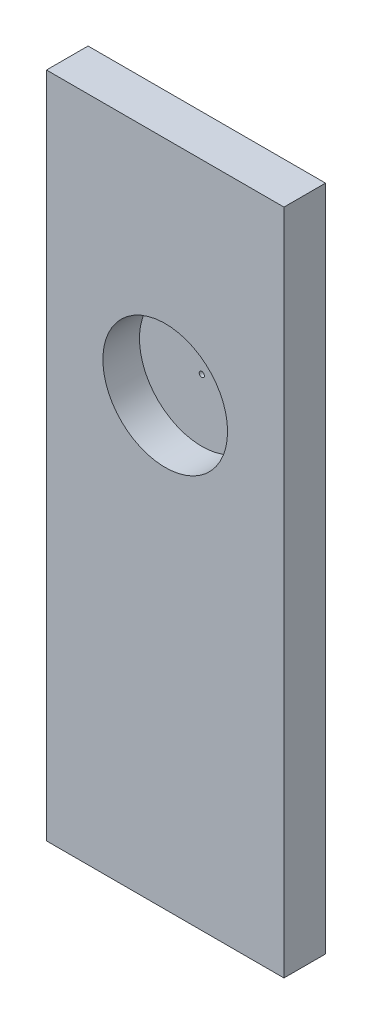
ISO-10303-21;
HEADER;
FILE_DESCRIPTION(('STEP AP214'),'2;1');
FILE_NAME('part.step','',(''),(''),'','','');
FILE_SCHEMA(('AUTOMOTIVE_DESIGN { 1 0 10303 214 1 1 1 1 }'));
ENDSEC;
DATA;
#1=APPLICATION_CONTEXT('core data for automotive mechanical design processes');
#2=APPLICATION_PROTOCOL_DEFINITION('international standard','automotive_design',2000,#1);
#3=PRODUCT_CONTEXT('',#1,'mechanical');
#4=PRODUCT('Part','Part','',(#3));
#5=PRODUCT_RELATED_PRODUCT_CATEGORY('part','',(#4));
#6=PRODUCT_DEFINITION_FORMATION('','',#4);
#7=PRODUCT_DEFINITION_CONTEXT('part definition',#1,'design');
#8=PRODUCT_DEFINITION('design','',#6,#7);
#9=PRODUCT_DEFINITION_SHAPE('','',#8);
#10=(LENGTH_UNIT() NAMED_UNIT(*) SI_UNIT(.MILLI.,.METRE.));
#11=(NAMED_UNIT(*) PLANE_ANGLE_UNIT() SI_UNIT($,.RADIAN.));
#12=(NAMED_UNIT(*) SI_UNIT($,.STERADIAN.) SOLID_ANGLE_UNIT());
#13=UNCERTAINTY_MEASURE_WITH_UNIT(LENGTH_MEASURE(1.E-05),#10,'distance_accuracy_value','');
#14=(GEOMETRIC_REPRESENTATION_CONTEXT(3) GLOBAL_UNCERTAINTY_ASSIGNED_CONTEXT((#13)) GLOBAL_UNIT_ASSIGNED_CONTEXT((#10,
#11,#12)) REPRESENTATION_CONTEXT('',''));
#15=CARTESIAN_POINT('',(0.,0.,0.));
#16=DIRECTION('',(0.,0.,1.));
#17=DIRECTION('',(1.,0.,0.));
#18=AXIS2_PLACEMENT_3D('',#15,#16,#17);
#19=CARTESIAN_POINT('',(-18.13941,51.0016125,6.35));
#20=DIRECTION('',(1.,0.,0.));
#21=DIRECTION('',(0.,1.,0.));
#22=AXIS2_PLACEMENT_3D('',#19,#20,#21);
#23=PLANE('',#22);
#24=DIRECTION('',(0.,-1.,0.));
#25=VECTOR('',#24,1.);
#26=CARTESIAN_POINT('',(-18.13941,51.0016125,0.));
#27=LINE('',#26,#25);
#28=CARTESIAN_POINT('',(-18.13941,51.0016125,0.));
#29=VERTEX_POINT('',#28);
#30=CARTESIAN_POINT('',(-18.13941,-51.0016125,0.));
#31=VERTEX_POINT('',#30);
#32=EDGE_CURVE('E124',#29,#31,#27,.T.);
#33=ORIENTED_EDGE('',*,*,#32,.T.);
#34=DIRECTION('',(0.,0.,-1.));
#35=VECTOR('',#34,1.);
#36=CARTESIAN_POINT('',(-18.13941,-51.0016125,6.35));
#37=LINE('',#36,#35);
#38=CARTESIAN_POINT('',(-18.13941,-51.0016125,6.35));
#39=VERTEX_POINT('',#38);
#40=EDGE_CURVE('E11',#39,#31,#37,.T.);
#41=ORIENTED_EDGE('',*,*,#40,.F.);
#42=DIRECTION('',(0.,-1.,0.));
#43=VECTOR('',#42,1.);
#44=CARTESIAN_POINT('',(-18.13941,51.0016125,6.35));
#45=LINE('',#44,#43);
#46=CARTESIAN_POINT('',(-18.13941,51.0016125,6.35));
#47=VERTEX_POINT('',#46);
#48=EDGE_CURVE('E127',#47,#39,#45,.T.);
#49=ORIENTED_EDGE('',*,*,#48,.F.);
#50=DIRECTION('',(0.,0.,-1.));
#51=VECTOR('',#50,1.);
#52=CARTESIAN_POINT('',(-18.13941,51.0016125,6.35));
#53=LINE('',#52,#51);
#54=EDGE_CURVE('E133',#47,#29,#53,.T.);
#55=ORIENTED_EDGE('',*,*,#54,.T.);
#56=EDGE_LOOP('',(#33,#41,#49,#55));
#57=FACE_BOUND('',#56,.T.);
#58=ADVANCED_FACE('F31',(#57),#23,.F.);
#59=CARTESIAN_POINT('',(-18.13941,-51.0016125,6.35));
#60=DIRECTION('',(0.,1.,0.));
#61=DIRECTION('',(0.,0.,1.));
#62=AXIS2_PLACEMENT_3D('',#59,#60,#61);
#63=PLANE('',#62);
#64=CARTESIAN_POINT('',(11.7894100000311,-51.0016125,3.17499999999995));
#65=DIRECTION('',(0.,-1.,0.));
#66=DIRECTION('',(0.,0.,-1.));
#67=AXIS2_PLACEMENT_3D('',#64,#65,#66);
#68=CIRCLE('',#67,1.2573);
#69=CARTESIAN_POINT('',(11.7894100000311,-51.0016125,1.91769999999995));
#70=VERTEX_POINT('',#69);
#71=EDGE_CURVE('E173',#70,#70,#68,.T.);
#72=ORIENTED_EDGE('',*,*,#71,.F.);
#73=EDGE_LOOP('',(#72));
#74=FACE_BOUND('',#73,.T.);
#75=CARTESIAN_POINT('',(-13.1787899999682,-51.0016125,3.17499999999993));
#76=DIRECTION('',(0.,-1.,0.));
#77=DIRECTION('',(0.,0.,-1.));
#78=AXIS2_PLACEMENT_3D('',#75,#76,#77);
#79=CIRCLE('',#78,1.2573);
#80=CARTESIAN_POINT('',(-13.1787899999682,-51.0016125,1.91769999999994));
#81=VERTEX_POINT('',#80);
#82=EDGE_CURVE('E95',#81,#81,#79,.T.);
#83=ORIENTED_EDGE('',*,*,#82,.F.);
#84=EDGE_LOOP('',(#83));
#85=FACE_BOUND('',#84,.T.);
#86=DIRECTION('',(1.,0.,0.));
#87=VECTOR('',#86,1.);
#88=CARTESIAN_POINT('',(-18.13941,-51.0016125,0.));
#89=LINE('',#88,#87);
#90=CARTESIAN_POINT('',(18.13941,-51.0016125,0.));
#91=VERTEX_POINT('',#90);
#92=EDGE_CURVE('E136',#31,#91,#89,.T.);
#93=ORIENTED_EDGE('',*,*,#92,.T.);
#94=DIRECTION('',(0.,0.,-1.));
#95=VECTOR('',#94,1.);
#96=CARTESIAN_POINT('',(18.13941,-51.0016125,6.35));
#97=LINE('',#96,#95);
#98=CARTESIAN_POINT('',(18.13941,-51.0016125,6.35));
#99=VERTEX_POINT('',#98);
#100=EDGE_CURVE('E39',#99,#91,#97,.T.);
#101=ORIENTED_EDGE('',*,*,#100,.F.);
#102=DIRECTION('',(1.,0.,0.));
#103=VECTOR('',#102,1.);
#104=CARTESIAN_POINT('',(-18.13941,-51.0016125,6.35));
#105=LINE('',#104,#103);
#106=EDGE_CURVE('E78',#39,#99,#105,.T.);
#107=ORIENTED_EDGE('',*,*,#106,.F.);
#108=ORIENTED_EDGE('',*,*,#40,.T.);
#109=EDGE_LOOP('',(#93,#101,#107,#108));
#110=FACE_BOUND('',#109,.T.);
#111=ADVANCED_FACE('F160',(#74,#85,#110),#63,.F.);
#112=CARTESIAN_POINT('',(18.13941,51.0016125,6.35));
#113=DIRECTION('',(-1.,0.,0.));
#114=DIRECTION('',(0.,-1.,0.));
#115=AXIS2_PLACEMENT_3D('',#112,#113,#114);
#116=PLANE('',#115);
#117=DIRECTION('',(0.,1.,0.));
#118=VECTOR('',#117,1.);
#119=CARTESIAN_POINT('',(18.13941,51.0016125,0.));
#120=LINE('',#119,#118);
#121=CARTESIAN_POINT('',(18.13941,51.0016125,0.));
#122=VERTEX_POINT('',#121);
#123=EDGE_CURVE('E65',#91,#122,#120,.T.);
#124=ORIENTED_EDGE('',*,*,#123,.T.);
#125=DIRECTION('',(0.,0.,-1.));
#126=VECTOR('',#125,1.);
#127=CARTESIAN_POINT('',(18.13941,51.0016125,6.35));
#128=LINE('',#127,#126);
#129=CARTESIAN_POINT('',(18.13941,51.0016125,6.35));
#130=VERTEX_POINT('',#129);
#131=EDGE_CURVE('E141',#130,#122,#128,.T.);
#132=ORIENTED_EDGE('',*,*,#131,.F.);
#133=DIRECTION('',(0.,1.,0.));
#134=VECTOR('',#133,1.);
#135=CARTESIAN_POINT('',(18.13941,51.0016125,6.35));
#136=LINE('',#135,#134);
#137=EDGE_CURVE('E130',#99,#130,#136,.T.);
#138=ORIENTED_EDGE('',*,*,#137,.F.);
#139=ORIENTED_EDGE('',*,*,#100,.T.);
#140=EDGE_LOOP('',(#124,#132,#138,#139));
#141=FACE_BOUND('',#140,.T.);
#142=ADVANCED_FACE('F143',(#141),#116,.F.);
#143=CARTESIAN_POINT('',(-18.13941,51.0016125,6.35));
#144=DIRECTION('',(0.,-1.,0.));
#145=DIRECTION('',(0.,0.,-1.));
#146=AXIS2_PLACEMENT_3D('',#143,#144,#145);
#147=PLANE('',#146);
#148=DIRECTION('',(-1.,0.,0.));
#149=VECTOR('',#148,1.);
#150=CARTESIAN_POINT('',(-18.13941,51.0016125,0.));
#151=LINE('',#150,#149);
#152=EDGE_CURVE('E71',#122,#29,#151,.T.);
#153=ORIENTED_EDGE('',*,*,#152,.T.);
#154=ORIENTED_EDGE('',*,*,#54,.F.);
#155=DIRECTION('',(-1.,0.,0.));
#156=VECTOR('',#155,1.);
#157=CARTESIAN_POINT('',(-18.13941,51.0016125,6.35));
#158=LINE('',#157,#156);
#159=EDGE_CURVE('E47',#130,#47,#158,.T.);
#160=ORIENTED_EDGE('',*,*,#159,.F.);
#161=ORIENTED_EDGE('',*,*,#131,.T.);
#162=EDGE_LOOP('',(#153,#154,#160,#161));
#163=FACE_BOUND('',#162,.T.);
#164=ADVANCED_FACE('F150',(#163),#147,.F.);
#165=CARTESIAN_POINT('',(-18.13941,-51.0016125,6.35));
#166=DIRECTION('',(0.,0.,1.));
#167=DIRECTION('',(1.,0.,0.));
#168=AXIS2_PLACEMENT_3D('',#165,#166,#167);
#169=PLANE('',#168);
#170=CARTESIAN_POINT('',(0.,17.0005375,6.35));
#171=DIRECTION('',(0.,0.,1.));
#172=DIRECTION('',(1.,0.,0.));
#173=AXIS2_PLACEMENT_3D('',#170,#171,#172);
#174=CIRCLE('',#173,9.525);
#175=CARTESIAN_POINT('',(9.525,17.0005375,6.35));
#176=VERTEX_POINT('',#175);
#177=EDGE_CURVE('E118',#176,#176,#174,.T.);
#178=ORIENTED_EDGE('',*,*,#177,.F.);
#179=EDGE_LOOP('',(#178));
#180=FACE_BOUND('',#179,.T.);
#181=ORIENTED_EDGE('',*,*,#48,.T.);
#182=ORIENTED_EDGE('',*,*,#106,.T.);
#183=ORIENTED_EDGE('',*,*,#137,.T.);
#184=ORIENTED_EDGE('',*,*,#159,.T.);
#185=EDGE_LOOP('',(#181,#182,#183,#184));
#186=FACE_BOUND('',#185,.T.);
#187=ADVANCED_FACE('F152',(#180,#186),#169,.T.);
#188=CARTESIAN_POINT('',(-18.13941,-51.0016125,0.));
#189=DIRECTION('',(0.,0.,1.));
#190=DIRECTION('',(1.,0.,0.));
#191=AXIS2_PLACEMENT_3D('',#188,#189,#190);
#192=PLANE('',#191);
#193=CARTESIAN_POINT('',(0.,17.0005375,0.));
#194=DIRECTION('',(0.,0.,1.));
#195=DIRECTION('',(1.,0.,0.));
#196=AXIS2_PLACEMENT_3D('',#193,#194,#195);
#197=CIRCLE('',#196,0.396875);
#198=CARTESIAN_POINT('',(0.396875,17.0005375,0.));
#199=VERTEX_POINT('',#198);
#200=EDGE_CURVE('E115',#199,#199,#197,.T.);
#201=ORIENTED_EDGE('',*,*,#200,.T.);
#202=EDGE_LOOP('',(#201));
#203=FACE_BOUND('',#202,.T.);
#204=ORIENTED_EDGE('',*,*,#32,.F.);
#205=ORIENTED_EDGE('',*,*,#152,.F.);
#206=ORIENTED_EDGE('',*,*,#123,.F.);
#207=ORIENTED_EDGE('',*,*,#92,.F.);
#208=EDGE_LOOP('',(#204,#205,#206,#207));
#209=FACE_BOUND('',#208,.T.);
#210=ADVANCED_FACE('F146',(#203,#209),#192,.F.);
#211=CARTESIAN_POINT('',(0.,17.0005375,0.762));
#212=DIRECTION('',(0.,0.,1.));
#213=DIRECTION('',(1.,0.,0.));
#214=AXIS2_PLACEMENT_3D('',#211,#212,#213);
#215=CYLINDRICAL_SURFACE('',#214,9.525);
#216=CARTESIAN_POINT('',(0.,17.0005375,0.762));
#217=DIRECTION('',(0.,0.,1.));
#218=DIRECTION('',(1.,0.,0.));
#219=AXIS2_PLACEMENT_3D('',#216,#217,#218);
#220=CIRCLE('',#219,9.525);
#221=CARTESIAN_POINT('',(9.525,17.0005375,0.762));
#222=VERTEX_POINT('',#221);
#223=EDGE_CURVE('E121',#222,#222,#220,.T.);
#224=ORIENTED_EDGE('',*,*,#223,.F.);
#225=EDGE_LOOP('',(#224));
#226=FACE_BOUND('',#225,.T.);
#227=ORIENTED_EDGE('',*,*,#177,.T.);
#228=EDGE_LOOP('',(#227));
#229=FACE_BOUND('',#228,.T.);
#230=ADVANCED_FACE('F203',(#226,#229),#215,.F.);
#231=CARTESIAN_POINT('',(0.,17.0005375,0.762));
#232=DIRECTION('',(0.,0.,1.));
#233=DIRECTION('',(1.,0.,0.));
#234=AXIS2_PLACEMENT_3D('',#231,#232,#233);
#235=PLANE('',#234);
#236=CARTESIAN_POINT('',(0.,17.0005375,0.762));
#237=DIRECTION('',(0.,0.,1.));
#238=DIRECTION('',(1.,0.,0.));
#239=AXIS2_PLACEMENT_3D('',#236,#237,#238);
#240=CIRCLE('',#239,0.396875);
#241=CARTESIAN_POINT('',(0.396875,17.0005375,0.762));
#242=VERTEX_POINT('',#241);
#243=EDGE_CURVE('E114',#242,#242,#240,.T.);
#244=ORIENTED_EDGE('',*,*,#243,.F.);
#245=EDGE_LOOP('',(#244));
#246=FACE_BOUND('',#245,.T.);
#247=ORIENTED_EDGE('',*,*,#223,.T.);
#248=EDGE_LOOP('',(#247));
#249=FACE_BOUND('',#248,.T.);
#250=ADVANCED_FACE('F199',(#246,#249),#235,.T.);
#251=CARTESIAN_POINT('',(0.,17.0005375,0.));
#252=DIRECTION('',(0.,0.,1.));
#253=DIRECTION('',(1.,0.,0.));
#254=AXIS2_PLACEMENT_3D('',#251,#252,#253);
#255=CYLINDRICAL_SURFACE('',#254,0.396875);
#256=ORIENTED_EDGE('',*,*,#200,.F.);
#257=EDGE_LOOP('',(#256));
#258=FACE_BOUND('',#257,.T.);
#259=ORIENTED_EDGE('',*,*,#243,.T.);
#260=EDGE_LOOP('',(#259));
#261=FACE_BOUND('',#260,.T.);
#262=ADVANCED_FACE('F195',(#258,#261),#255,.F.);
#263=CARTESIAN_POINT('',(-13.1787899999682,-41.8576125,3.17499999999993));
#264=DIRECTION('',(0.,-1.,0.));
#265=DIRECTION('',(0.,0.,-1.));
#266=AXIS2_PLACEMENT_3D('',#263,#264,#265);
#267=CONICAL_SURFACE('',#266,0.996949999999996,1.02974425867665);
#268=CARTESIAN_POINT('',(-13.1787899999682,-41.2585845058605,3.17499999999993));
#269=VERTEX_POINT('',#268);
#270=VERTEX_LOOP('',#269);
#271=FACE_BOUND('',#270,.T.);
#272=CARTESIAN_POINT('',(-13.1787899999682,-41.8576125,3.17499999999993));
#273=DIRECTION('',(0.,-1.,0.));
#274=DIRECTION('',(0.,0.,-1.));
#275=AXIS2_PLACEMENT_3D('',#272,#273,#274);
#276=CIRCLE('',#275,0.996949999999996);
#277=CARTESIAN_POINT('',(-13.1787899999682,-41.8576125,2.17804999999994));
#278=VERTEX_POINT('',#277);
#279=EDGE_CURVE('E111',#278,#278,#276,.T.);
#280=ORIENTED_EDGE('',*,*,#279,.T.);
#281=EDGE_LOOP('',(#280));
#282=FACE_BOUND('',#281,.T.);
#283=ADVANCED_FACE('F191',(#271,#282),#267,.F.);
#284=CARTESIAN_POINT('',(-13.1787899999682,-51.0016125,3.17499999999993));
#285=DIRECTION('',(0.,-1.,0.));
#286=DIRECTION('',(0.,0.,-1.));
#287=AXIS2_PLACEMENT_3D('',#284,#285,#286);
#288=CYLINDRICAL_SURFACE('',#287,0.996949999999998);
#289=ORIENTED_EDGE('',*,*,#279,.F.);
#290=EDGE_LOOP('',(#289));
#291=FACE_BOUND('',#290,.T.);
#292=CARTESIAN_POINT('',(-13.1787899999682,-43.3816125,3.17499999999993));
#293=DIRECTION('',(0.,-1.,0.));
#294=DIRECTION('',(0.,0.,-1.));
#295=AXIS2_PLACEMENT_3D('',#292,#293,#294);
#296=CIRCLE('',#295,0.99695);
#297=CARTESIAN_POINT('',(-13.1787899999682,-43.3816125,2.17804999999993));
#298=VERTEX_POINT('',#297);
#299=EDGE_CURVE('E108',#298,#298,#296,.T.);
#300=ORIENTED_EDGE('',*,*,#299,.T.);
#301=EDGE_LOOP('',(#300));
#302=FACE_BOUND('',#301,.T.);
#303=ADVANCED_FACE('F183',(#291,#302),#288,.F.);
#304=CARTESIAN_POINT('',(-12.1818399999682,-43.3816125,3.17499999999993));
#305=DIRECTION('',(0.,1.,0.));
#306=DIRECTION('',(0.,0.,1.));
#307=AXIS2_PLACEMENT_3D('',#304,#305,#306);
#308=PLANE('',#307);
#309=ORIENTED_EDGE('',*,*,#299,.F.);
#310=EDGE_LOOP('',(#309));
#311=FACE_BOUND('',#310,.T.);
#312=CARTESIAN_POINT('',(-13.1787899999682,-43.3816125,3.17499999999993));
#313=DIRECTION('',(0.,-1.,0.));
#314=DIRECTION('',(0.,0.,-1.));
#315=AXIS2_PLACEMENT_3D('',#312,#313,#314);
#316=CIRCLE('',#315,1.2573);
#317=CARTESIAN_POINT('',(-13.1787899999682,-43.3816125,1.91769999999994));
#318=VERTEX_POINT('',#317);
#319=EDGE_CURVE('E99',#318,#318,#316,.T.);
#320=ORIENTED_EDGE('',*,*,#319,.T.);
#321=EDGE_LOOP('',(#320));
#322=FACE_BOUND('',#321,.T.);
#323=ADVANCED_FACE('F177',(#311,#322),#308,.F.);
#324=CARTESIAN_POINT('',(-13.1787899999682,-51.0016125,3.17499999999993));
#325=DIRECTION('',(0.,-1.,0.));
#326=DIRECTION('',(0.,0.,-1.));
#327=AXIS2_PLACEMENT_3D('',#324,#325,#326);
#328=CYLINDRICAL_SURFACE('',#327,1.2573);
#329=ORIENTED_EDGE('',*,*,#319,.F.);
#330=EDGE_LOOP('',(#329));
#331=FACE_BOUND('',#330,.T.);
#332=ORIENTED_EDGE('',*,*,#82,.T.);
#333=EDGE_LOOP('',(#332));
#334=FACE_BOUND('',#333,.T.);
#335=ADVANCED_FACE('F89',(#331,#334),#328,.F.);
#336=CARTESIAN_POINT('',(11.7894100000311,-41.8576125,3.17499999999995));
#337=DIRECTION('',(0.,-1.,0.));
#338=DIRECTION('',(0.,0.,-1.));
#339=AXIS2_PLACEMENT_3D('',#336,#337,#338);
#340=CONICAL_SURFACE('',#339,0.996949999999996,1.02974425867665);
#341=CARTESIAN_POINT('',(11.7894100000311,-41.2585845058605,3.17499999999995));
#342=VERTEX_POINT('',#341);
#343=VERTEX_LOOP('',#342);
#344=FACE_BOUND('',#343,.T.);
#345=CARTESIAN_POINT('',(11.7894100000311,-41.8576125,3.17499999999995));
#346=DIRECTION('',(0.,-1.,0.));
#347=DIRECTION('',(0.,0.,-1.));
#348=AXIS2_PLACEMENT_3D('',#345,#346,#347);
#349=CIRCLE('',#348,0.996949999999996);
#350=CARTESIAN_POINT('',(11.7894100000311,-41.8576125,2.17804999999995));
#351=VERTEX_POINT('',#350);
#352=EDGE_CURVE('E93',#351,#351,#349,.T.);
#353=ORIENTED_EDGE('',*,*,#352,.T.);
#354=EDGE_LOOP('',(#353));
#355=FACE_BOUND('',#354,.T.);
#356=ADVANCED_FACE('F85',(#344,#355),#340,.F.);
#357=CARTESIAN_POINT('',(11.7894100000311,-51.0016125,3.17499999999995));
#358=DIRECTION('',(0.,-1.,0.));
#359=DIRECTION('',(0.,0.,-1.));
#360=AXIS2_PLACEMENT_3D('',#357,#358,#359);
#361=CYLINDRICAL_SURFACE('',#360,0.996949999999998);
#362=ORIENTED_EDGE('',*,*,#352,.F.);
#363=EDGE_LOOP('',(#362));
#364=FACE_BOUND('',#363,.T.);
#365=CARTESIAN_POINT('',(11.7894100000311,-43.3816125,3.17499999999995));
#366=DIRECTION('',(0.,-1.,0.));
#367=DIRECTION('',(0.,0.,-1.));
#368=AXIS2_PLACEMENT_3D('',#365,#366,#367);
#369=CIRCLE('',#368,0.99695);
#370=CARTESIAN_POINT('',(11.7894100000311,-43.3816125,2.17804999999995));
#371=VERTEX_POINT('',#370);
#372=EDGE_CURVE('E96',#371,#371,#369,.T.);
#373=ORIENTED_EDGE('',*,*,#372,.T.);
#374=EDGE_LOOP('',(#373));
#375=FACE_BOUND('',#374,.T.);
#376=ADVANCED_FACE('F88',(#364,#375),#361,.F.);
#377=CARTESIAN_POINT('',(12.7863600000311,-43.3816125,3.17499999999995));
#378=DIRECTION('',(0.,1.,0.));
#379=DIRECTION('',(0.,0.,1.));
#380=AXIS2_PLACEMENT_3D('',#377,#378,#379);
#381=PLANE('',#380);
#382=ORIENTED_EDGE('',*,*,#372,.F.);
#383=EDGE_LOOP('',(#382));
#384=FACE_BOUND('',#383,.T.);
#385=CARTESIAN_POINT('',(11.7894100000311,-43.3816125,3.17499999999995));
#386=DIRECTION('',(0.,-1.,0.));
#387=DIRECTION('',(0.,0.,-1.));
#388=AXIS2_PLACEMENT_3D('',#385,#386,#387);
#389=CIRCLE('',#388,1.2573);
#390=CARTESIAN_POINT('',(11.7894100000311,-43.3816125,1.91769999999995));
#391=VERTEX_POINT('',#390);
#392=EDGE_CURVE('E102',#391,#391,#389,.T.);
#393=ORIENTED_EDGE('',*,*,#392,.T.);
#394=EDGE_LOOP('',(#393));
#395=FACE_BOUND('',#394,.T.);
#396=ADVANCED_FACE('F263',(#384,#395),#381,.F.);
#397=CARTESIAN_POINT('',(11.7894100000311,-51.0016125,3.17499999999995));
#398=DIRECTION('',(0.,-1.,0.));
#399=DIRECTION('',(0.,0.,-1.));
#400=AXIS2_PLACEMENT_3D('',#397,#398,#399);
#401=CYLINDRICAL_SURFACE('',#400,1.2573);
#402=ORIENTED_EDGE('',*,*,#392,.F.);
#403=EDGE_LOOP('',(#402));
#404=FACE_BOUND('',#403,.T.);
#405=ORIENTED_EDGE('',*,*,#71,.T.);
#406=EDGE_LOOP('',(#405));
#407=FACE_BOUND('',#406,.T.);
#408=ADVANCED_FACE('F271',(#404,#407),#401,.F.);
#409=CLOSED_SHELL('',(#58,#111,#142,#164,#187,#210,#230,#250,#262,#283,#303,#323,#335,#356,#376,
#396,#408));
#410=MANIFOLD_SOLID_BREP('B2',#409);
#411=ADVANCED_BREP_SHAPE_REPRESENTATION('',(#18,#410),#14);
#412=SHAPE_DEFINITION_REPRESENTATION(#9,#411);
ENDSEC;
END-ISO-10303-21;
